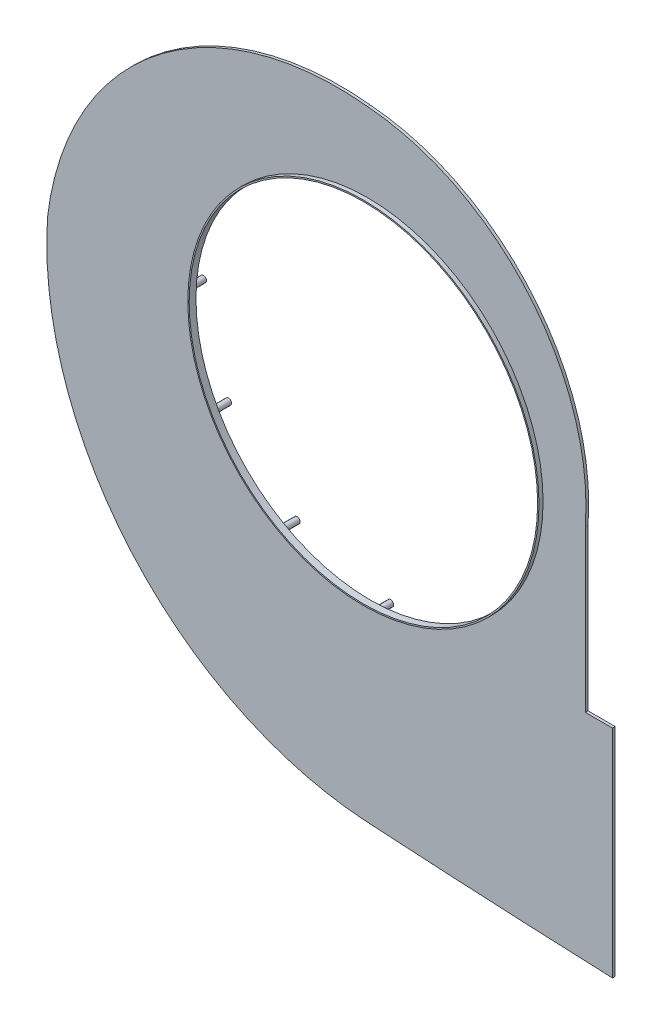
ISO-10303-21;
HEADER;
FILE_DESCRIPTION(('STEP AP214'),'2;1');
FILE_NAME('part.step','',(''),(''),'','','');
FILE_SCHEMA(('AUTOMOTIVE_DESIGN { 1 0 10303 214 1 1 1 1 }'));
ENDSEC;
DATA;
#1=APPLICATION_CONTEXT('core data for automotive mechanical design processes');
#2=APPLICATION_PROTOCOL_DEFINITION('international standard','automotive_design',2000,#1);
#3=PRODUCT_CONTEXT('',#1,'mechanical');
#4=PRODUCT('Part','Part','',(#3));
#5=PRODUCT_RELATED_PRODUCT_CATEGORY('part','',(#4));
#6=PRODUCT_DEFINITION_FORMATION('','',#4);
#7=PRODUCT_DEFINITION_CONTEXT('part definition',#1,'design');
#8=PRODUCT_DEFINITION('design','',#6,#7);
#9=PRODUCT_DEFINITION_SHAPE('','',#8);
#10=(LENGTH_UNIT() NAMED_UNIT(*) SI_UNIT(.MILLI.,.METRE.));
#11=(NAMED_UNIT(*) PLANE_ANGLE_UNIT() SI_UNIT($,.RADIAN.));
#12=(NAMED_UNIT(*) SI_UNIT($,.STERADIAN.) SOLID_ANGLE_UNIT());
#13=UNCERTAINTY_MEASURE_WITH_UNIT(LENGTH_MEASURE(1.E-05),#10,'distance_accuracy_value','');
#14=(GEOMETRIC_REPRESENTATION_CONTEXT(3) GLOBAL_UNCERTAINTY_ASSIGNED_CONTEXT((#13)) GLOBAL_UNIT_ASSIGNED_CONTEXT((#10,
#11,#12)) REPRESENTATION_CONTEXT('',''));
#15=CARTESIAN_POINT('',(0.,0.,0.));
#16=DIRECTION('',(0.,0.,1.));
#17=DIRECTION('',(1.,0.,0.));
#18=AXIS2_PLACEMENT_3D('',#15,#16,#17);
#19=CARTESIAN_POINT('',(576.066247787801,722.326123374747,4.));
#20=DIRECTION('',(0.,0.,-1.));
#21=DIRECTION('',(-1.,0.,0.));
#22=AXIS2_PLACEMENT_3D('',#19,#20,#21);
#23=CYLINDRICAL_SURFACE('',#22,501.999999999996);
#24=CARTESIAN_POINT('',(576.066247787801,722.326123374747,0.));
#25=DIRECTION('',(0.,0.,1.));
#26=DIRECTION('',(-1.,0.,0.));
#27=AXIS2_PLACEMENT_3D('',#24,#25,#26);
#28=CIRCLE('',#27,501.999999999996);
#29=CARTESIAN_POINT('',(75.2691276417093,757.057153497337,0.));
#30=VERTEX_POINT('',#29);
#31=CARTESIAN_POINT('',(545.269127641714,221.271697797341,0.));
#32=VERTEX_POINT('',#31);
#33=EDGE_CURVE('E140',#30,#32,#28,.T.);
#34=ORIENTED_EDGE('',*,*,#33,.T.);
#35=DIRECTION('',(0.,0.,-1.));
#36=VECTOR('',#35,1.);
#37=CARTESIAN_POINT('',(545.269127641714,221.271697797341,4.));
#38=LINE('',#37,#36);
#39=CARTESIAN_POINT('',(545.269127641714,221.271697797341,4.));
#40=VERTEX_POINT('',#39);
#41=EDGE_CURVE('E12',#40,#32,#38,.T.);
#42=ORIENTED_EDGE('',*,*,#41,.F.);
#43=CARTESIAN_POINT('',(576.066247787801,722.326123374747,4.));
#44=DIRECTION('',(0.,0.,1.));
#45=DIRECTION('',(-1.,0.,0.));
#46=AXIS2_PLACEMENT_3D('',#43,#44,#45);
#47=CIRCLE('',#46,501.999999999996);
#48=CARTESIAN_POINT('',(75.2691276417093,757.057153497337,4.));
#49=VERTEX_POINT('',#48);
#50=EDGE_CURVE('E152',#49,#40,#47,.T.);
#51=ORIENTED_EDGE('',*,*,#50,.F.);
#52=DIRECTION('',(0.,0.,-1.));
#53=VECTOR('',#52,1.);
#54=CARTESIAN_POINT('',(75.2691276417093,757.057153497337,4.));
#55=LINE('',#54,#53);
#56=EDGE_CURVE('E136',#49,#30,#55,.T.);
#57=ORIENTED_EDGE('',*,*,#56,.T.);
#58=EDGE_LOOP('',(#34,#42,#51,#57));
#59=FACE_BOUND('',#58,.T.);
#60=ADVANCED_FACE('F49',(#59),#23,.T.);
#61=CARTESIAN_POINT('',(1565.81350018343,16825.0408792696,4.));
#62=DIRECTION('',(0.,0.,-1.));
#63=DIRECTION('',(-1.,0.,0.));
#64=AXIS2_PLACEMENT_3D('',#61,#62,#63);
#65=CYLINDRICAL_SURFACE('',#64,16635.1033013906);
#66=CARTESIAN_POINT('',(1565.81350018343,16825.0408792696,0.));
#67=DIRECTION('',(0.,0.,1.));
#68=DIRECTION('',(1.,0.,0.));
#69=AXIS2_PLACEMENT_3D('',#66,#67,#68);
#70=CIRCLE('',#69,16635.1033013906);
#71=CARTESIAN_POINT('',(905.269127641709,203.057153497337,0.));
#72=VERTEX_POINT('',#71);
#73=EDGE_CURVE('E143',#32,#72,#70,.T.);
#74=ORIENTED_EDGE('',*,*,#73,.T.);
#75=DIRECTION('',(0.,0.,-1.));
#76=VECTOR('',#75,1.);
#77=CARTESIAN_POINT('',(905.269127641709,203.057153497337,4.));
#78=LINE('',#77,#76);
#79=CARTESIAN_POINT('',(905.269127641709,203.057153497337,4.));
#80=VERTEX_POINT('',#79);
#81=EDGE_CURVE('E58',#80,#72,#78,.T.);
#82=ORIENTED_EDGE('',*,*,#81,.F.);
#83=CARTESIAN_POINT('',(1565.81350018343,16825.0408792696,4.));
#84=DIRECTION('',(0.,0.,1.));
#85=DIRECTION('',(1.,0.,0.));
#86=AXIS2_PLACEMENT_3D('',#83,#84,#85);
#87=CIRCLE('',#86,16635.1033013906);
#88=EDGE_CURVE('E106',#40,#80,#87,.T.);
#89=ORIENTED_EDGE('',*,*,#88,.F.);
#90=ORIENTED_EDGE('',*,*,#41,.T.);
#91=EDGE_LOOP('',(#74,#82,#89,#90));
#92=FACE_BOUND('',#91,.T.);
#93=ADVANCED_FACE('F312',(#92),#65,.T.);
#94=CARTESIAN_POINT('',(905.269127641709,521.057153497337,4.));
#95=DIRECTION('',(-1.,0.,0.));
#96=DIRECTION('',(0.,0.,1.));
#97=AXIS2_PLACEMENT_3D('',#94,#95,#96);
#98=PLANE('',#97);
#99=DIRECTION('',(0.,1.,0.));
#100=VECTOR('',#99,1.);
#101=CARTESIAN_POINT('',(905.269127641709,521.057153497337,0.));
#102=LINE('',#101,#100);
#103=CARTESIAN_POINT('',(905.269127641709,521.057153497337,0.));
#104=VERTEX_POINT('',#103);
#105=EDGE_CURVE('E145',#72,#104,#102,.T.);
#106=ORIENTED_EDGE('',*,*,#105,.T.);
#107=DIRECTION('',(0.,0.,-1.));
#108=VECTOR('',#107,1.);
#109=CARTESIAN_POINT('',(905.269127641709,521.057153497337,4.));
#110=LINE('',#109,#108);
#111=CARTESIAN_POINT('',(905.269127641709,521.057153497337,4.));
#112=VERTEX_POINT('',#111);
#113=EDGE_CURVE('E156',#112,#104,#110,.T.);
#114=ORIENTED_EDGE('',*,*,#113,.F.);
#115=DIRECTION('',(0.,1.,0.));
#116=VECTOR('',#115,1.);
#117=CARTESIAN_POINT('',(905.269127641709,521.057153497337,4.));
#118=LINE('',#117,#116);
#119=EDGE_CURVE('E165',#80,#112,#118,.T.);
#120=ORIENTED_EDGE('',*,*,#119,.F.);
#121=ORIENTED_EDGE('',*,*,#81,.T.);
#122=EDGE_LOOP('',(#106,#114,#120,#121));
#123=FACE_BOUND('',#122,.T.);
#124=ADVANCED_FACE('F163',(#123),#98,.F.);
#125=CARTESIAN_POINT('',(865.269127641709,521.057153497337,4.));
#126=DIRECTION('',(0.,-1.,0.));
#127=DIRECTION('',(0.,0.,-1.));
#128=AXIS2_PLACEMENT_3D('',#125,#126,#127);
#129=PLANE('',#128);
#130=DIRECTION('',(-1.,0.,0.));
#131=VECTOR('',#130,1.);
#132=CARTESIAN_POINT('',(865.269127641709,521.057153497337,0.));
#133=LINE('',#132,#131);
#134=CARTESIAN_POINT('',(865.269127641709,521.057153497337,0.));
#135=VERTEX_POINT('',#134);
#136=EDGE_CURVE('E147',#104,#135,#133,.T.);
#137=ORIENTED_EDGE('',*,*,#136,.T.);
#138=DIRECTION('',(0.,0.,-1.));
#139=VECTOR('',#138,1.);
#140=CARTESIAN_POINT('',(865.269127641709,521.057153497337,4.));
#141=LINE('',#140,#139);
#142=CARTESIAN_POINT('',(865.269127641709,521.057153497337,4.));
#143=VERTEX_POINT('',#142);
#144=EDGE_CURVE('E131',#143,#135,#141,.T.);
#145=ORIENTED_EDGE('',*,*,#144,.F.);
#146=DIRECTION('',(-1.,0.,0.));
#147=VECTOR('',#146,1.);
#148=CARTESIAN_POINT('',(865.269127641709,521.057153497337,4.));
#149=LINE('',#148,#147);
#150=EDGE_CURVE('E122',#112,#143,#149,.T.);
#151=ORIENTED_EDGE('',*,*,#150,.F.);
#152=ORIENTED_EDGE('',*,*,#113,.T.);
#153=EDGE_LOOP('',(#137,#145,#151,#152));
#154=FACE_BOUND('',#153,.T.);
#155=ADVANCED_FACE('F172',(#154),#129,.F.);
#156=CARTESIAN_POINT('',(865.269127641709,521.057153497337,4.));
#157=DIRECTION('',(-1.,0.,0.));
#158=DIRECTION('',(0.,0.,1.));
#159=AXIS2_PLACEMENT_3D('',#156,#157,#158);
#160=PLANE('',#159);
#161=DIRECTION('',(0.,1.,0.));
#162=VECTOR('',#161,1.);
#163=CARTESIAN_POINT('',(865.269127641709,521.057153497337,0.));
#164=LINE('',#163,#162);
#165=CARTESIAN_POINT('',(865.269127641709,757.057153497337,0.));
#166=VERTEX_POINT('',#165);
#167=EDGE_CURVE('E130',#135,#166,#164,.T.);
#168=ORIENTED_EDGE('',*,*,#167,.T.);
#169=DIRECTION('',(0.,0.,-1.));
#170=VECTOR('',#169,1.);
#171=CARTESIAN_POINT('',(865.269127641709,757.057153497337,4.));
#172=LINE('',#171,#170);
#173=CARTESIAN_POINT('',(865.269127641709,757.057153497337,4.));
#174=VERTEX_POINT('',#173);
#175=EDGE_CURVE('E127',#174,#166,#172,.T.);
#176=ORIENTED_EDGE('',*,*,#175,.F.);
#177=DIRECTION('',(0.,1.,0.));
#178=VECTOR('',#177,1.);
#179=CARTESIAN_POINT('',(865.269127641709,521.057153497337,4.));
#180=LINE('',#179,#178);
#181=EDGE_CURVE('E116',#143,#174,#180,.T.);
#182=ORIENTED_EDGE('',*,*,#181,.F.);
#183=ORIENTED_EDGE('',*,*,#144,.T.);
#184=EDGE_LOOP('',(#168,#176,#182,#183));
#185=FACE_BOUND('',#184,.T.);
#186=ADVANCED_FACE('F128',(#185),#160,.F.);
#187=CARTESIAN_POINT('',(517.354671903609,784.203484600825,4.));
#188=DIRECTION('',(0.,0.,-1.));
#189=DIRECTION('',(-1.,0.,0.));
#190=AXIS2_PLACEMENT_3D('',#187,#188,#189);
#191=CYLINDRICAL_SURFACE('',#190,348.971906897846);
#192=CARTESIAN_POINT('',(517.354671903609,784.203484600825,0.));
#193=DIRECTION('',(0.,0.,1.));
#194=DIRECTION('',(-1.,0.,0.));
#195=AXIS2_PLACEMENT_3D('',#192,#193,#194);
#196=CIRCLE('',#195,348.971906897846);
#197=CARTESIAN_POINT('',(545.269127641709,1132.05715349734,0.));
#198=VERTEX_POINT('',#197);
#199=EDGE_CURVE('E92',#166,#198,#196,.T.);
#200=ORIENTED_EDGE('',*,*,#199,.T.);
#201=DIRECTION('',(0.,0.,-1.));
#202=VECTOR('',#201,1.);
#203=CARTESIAN_POINT('',(545.269127641709,1132.05715349734,4.));
#204=LINE('',#203,#202);
#205=CARTESIAN_POINT('',(545.269127641709,1132.05715349734,4.));
#206=VERTEX_POINT('',#205);
#207=EDGE_CURVE('E132',#206,#198,#204,.T.);
#208=ORIENTED_EDGE('',*,*,#207,.F.);
#209=CARTESIAN_POINT('',(517.354671903609,784.203484600825,4.));
#210=DIRECTION('',(0.,0.,1.));
#211=DIRECTION('',(-1.,0.,0.));
#212=AXIS2_PLACEMENT_3D('',#209,#210,#211);
#213=CIRCLE('',#212,348.971906897846);
#214=EDGE_CURVE('E120',#174,#206,#213,.T.);
#215=ORIENTED_EDGE('',*,*,#214,.F.);
#216=ORIENTED_EDGE('',*,*,#175,.T.);
#217=EDGE_LOOP('',(#200,#208,#215,#216));
#218=FACE_BOUND('',#217,.T.);
#219=ADVANCED_FACE('F134',(#218),#191,.T.);
#220=CARTESIAN_POINT('',(500.927222897748,705.599007443102,4.));
#221=DIRECTION('',(0.,0.,-1.));
#222=DIRECTION('',(-1.,0.,0.));
#223=AXIS2_PLACEMENT_3D('',#220,#221,#222);
#224=CYLINDRICAL_SURFACE('',#223,428.75722134133);
#225=CARTESIAN_POINT('',(500.927222897748,705.599007443102,0.));
#226=DIRECTION('',(0.,0.,1.));
#227=DIRECTION('',(-1.,0.,0.));
#228=AXIS2_PLACEMENT_3D('',#225,#226,#227);
#229=CIRCLE('',#228,428.75722134133);
#230=EDGE_CURVE('E98',#198,#30,#229,.T.);
#231=ORIENTED_EDGE('',*,*,#230,.T.);
#232=ORIENTED_EDGE('',*,*,#56,.F.);
#233=CARTESIAN_POINT('',(500.927222897748,705.599007443102,4.));
#234=DIRECTION('',(0.,0.,1.));
#235=DIRECTION('',(-1.,0.,0.));
#236=AXIS2_PLACEMENT_3D('',#233,#234,#235);
#237=CIRCLE('',#236,428.75722134133);
#238=EDGE_CURVE('E66',#206,#49,#237,.T.);
#239=ORIENTED_EDGE('',*,*,#238,.F.);
#240=ORIENTED_EDGE('',*,*,#207,.T.);
#241=EDGE_LOOP('',(#231,#232,#239,#240));
#242=FACE_BOUND('',#241,.T.);
#243=ADVANCED_FACE('F319',(#242),#224,.T.);
#244=CARTESIAN_POINT('',(576.066247787801,722.326123374747,4.));
#245=DIRECTION('',(0.,0.,-1.));
#246=DIRECTION('',(-1.,0.,0.));
#247=AXIS2_PLACEMENT_3D('',#244,#245,#246);
#248=PLANE('',#247);
#249=CARTESIAN_POINT('',(545.269127641709,758.057153497338,4.));
#250=DIRECTION('',(0.,0.,-1.));
#251=DIRECTION('',(-1.,0.,0.));
#252=AXIS2_PLACEMENT_3D('',#249,#250,#251);
#253=CIRCLE('',#252,258.);
#254=CARTESIAN_POINT('',(287.269127641709,758.057153497338,4.));
#255=VERTEX_POINT('',#254);
#256=EDGE_CURVE('E177',#255,#255,#253,.T.);
#257=ORIENTED_EDGE('',*,*,#256,.T.);
#258=EDGE_LOOP('',(#257));
#259=FACE_BOUND('',#258,.T.);
#260=ORIENTED_EDGE('',*,*,#50,.T.);
#261=ORIENTED_EDGE('',*,*,#88,.T.);
#262=ORIENTED_EDGE('',*,*,#119,.T.);
#263=ORIENTED_EDGE('',*,*,#150,.T.);
#264=ORIENTED_EDGE('',*,*,#181,.T.);
#265=ORIENTED_EDGE('',*,*,#214,.T.);
#266=ORIENTED_EDGE('',*,*,#238,.T.);
#267=EDGE_LOOP('',(#260,#261,#262,#263,#264,#265,#266));
#268=FACE_BOUND('',#267,.T.);
#269=ADVANCED_FACE('F118',(#259,#268),#248,.F.);
#270=CARTESIAN_POINT('',(576.066247787801,722.326123374747,0.));
#271=DIRECTION('',(0.,0.,-1.));
#272=DIRECTION('',(-1.,0.,0.));
#273=AXIS2_PLACEMENT_3D('',#270,#271,#272);
#274=PLANE('',#273);
#275=CARTESIAN_POINT('',(407.769127641712,996.21413953806,0.));
#276=DIRECTION('',(0.,0.,-1.));
#277=DIRECTION('',(-0.866025403784445,-0.499999999999989,0.));
#278=AXIS2_PLACEMENT_3D('',#275,#276,#277);
#279=CIRCLE('',#278,4.49999999999967);
#280=CARTESIAN_POINT('',(403.872013324682,993.96413953806,0.));
#281=VERTEX_POINT('',#280);
#282=EDGE_CURVE('E253',#281,#281,#279,.T.);
#283=ORIENTED_EDGE('',*,*,#282,.F.);
#284=EDGE_LOOP('',(#283));
#285=FACE_BOUND('',#284,.T.);
#286=CARTESIAN_POINT('',(307.11214160099,895.55715349734,0.));
#287=DIRECTION('',(0.,0.,-1.));
#288=DIRECTION('',(-0.50000000000001,-0.866025403784433,0.));
#289=AXIS2_PLACEMENT_3D('',#286,#287,#288);
#290=CIRCLE('',#289,4.49999999999967);
#291=CARTESIAN_POINT('',(304.86214160099,891.660039180311,0.));
#292=VERTEX_POINT('',#291);
#293=EDGE_CURVE('E247',#292,#292,#290,.T.);
#294=ORIENTED_EDGE('',*,*,#293,.F.);
#295=EDGE_LOOP('',(#294));
#296=FACE_BOUND('',#295,.T.);
#297=CARTESIAN_POINT('',(270.269127641709,758.05715349734,0.));
#298=DIRECTION('',(0.,0.,-1.));
#299=DIRECTION('',(0.,-1.,0.));
#300=AXIS2_PLACEMENT_3D('',#297,#298,#299);
#301=CIRCLE('',#300,4.49999999999967);
#302=CARTESIAN_POINT('',(270.269127641709,753.557153497341,0.));
#303=VERTEX_POINT('',#302);
#304=EDGE_CURVE('E241',#303,#303,#301,.T.);
#305=ORIENTED_EDGE('',*,*,#304,.F.);
#306=EDGE_LOOP('',(#305));
#307=FACE_BOUND('',#306,.T.);
#308=CARTESIAN_POINT('',(307.112141600987,620.55715349734,0.));
#309=DIRECTION('',(0.,0.,-1.));
#310=DIRECTION('',(0.499999999999992,-0.866025403784443,0.));
#311=AXIS2_PLACEMENT_3D('',#308,#309,#310);
#312=CIRCLE('',#311,4.49999999999967);
#313=CARTESIAN_POINT('',(309.362141600987,616.66003918031,0.));
#314=VERTEX_POINT('',#313);
#315=EDGE_CURVE('E235',#314,#314,#312,.T.);
#316=ORIENTED_EDGE('',*,*,#315,.F.);
#317=EDGE_LOOP('',(#316));
#318=FACE_BOUND('',#317,.T.);
#319=CARTESIAN_POINT('',(407.769127641707,519.900167456618,0.));
#320=DIRECTION('',(0.,0.,-1.));
#321=DIRECTION('',(0.866025403784435,-0.500000000000007,0.));
#322=AXIS2_PLACEMENT_3D('',#319,#320,#321);
#323=CIRCLE('',#322,4.49999999999967);
#324=CARTESIAN_POINT('',(411.666241958737,517.650167456618,0.));
#325=VERTEX_POINT('',#324);
#326=EDGE_CURVE('E229',#325,#325,#323,.T.);
#327=ORIENTED_EDGE('',*,*,#326,.F.);
#328=EDGE_LOOP('',(#327));
#329=FACE_BOUND('',#328,.T.);
#330=CARTESIAN_POINT('',(545.269127641709,483.057153497338,0.));
#331=DIRECTION('',(0.,0.,-1.));
#332=DIRECTION('',(1.,0.,0.));
#333=AXIS2_PLACEMENT_3D('',#330,#331,#332);
#334=CIRCLE('',#333,4.49999999999967);
#335=CARTESIAN_POINT('',(549.769127641709,483.057153497338,0.));
#336=VERTEX_POINT('',#335);
#337=EDGE_CURVE('E223',#336,#336,#334,.T.);
#338=ORIENTED_EDGE('',*,*,#337,.F.);
#339=EDGE_LOOP('',(#338));
#340=FACE_BOUND('',#339,.T.);
#341=CARTESIAN_POINT('',(682.769127641708,519.900167456616,0.));
#342=DIRECTION('',(0.,0.,-1.));
#343=DIRECTION('',(0.866025403784442,0.499999999999995,0.));
#344=AXIS2_PLACEMENT_3D('',#341,#342,#343);
#345=CIRCLE('',#344,4.49999999999967);
#346=CARTESIAN_POINT('',(686.666241958737,522.150167456616,0.));
#347=VERTEX_POINT('',#346);
#348=EDGE_CURVE('E217',#347,#347,#345,.T.);
#349=ORIENTED_EDGE('',*,*,#348,.F.);
#350=EDGE_LOOP('',(#349));
#351=FACE_BOUND('',#350,.T.);
#352=CARTESIAN_POINT('',(783.426113682429,620.557153497336,0.));
#353=DIRECTION('',(0.,0.,-1.));
#354=DIRECTION('',(0.500000000000004,0.866025403784436,0.));
#355=AXIS2_PLACEMENT_3D('',#352,#353,#354);
#356=CIRCLE('',#355,4.49999999999967);
#357=CARTESIAN_POINT('',(785.676113682429,624.454267814366,0.));
#358=VERTEX_POINT('',#357);
#359=EDGE_CURVE('E211',#358,#358,#356,.T.);
#360=ORIENTED_EDGE('',*,*,#359,.F.);
#361=EDGE_LOOP('',(#360));
#362=FACE_BOUND('',#361,.T.);
#363=CARTESIAN_POINT('',(820.269127641709,758.057153497337,0.));
#364=DIRECTION('',(0.,0.,-1.));
#365=DIRECTION('',(0.,1.,0.));
#366=AXIS2_PLACEMENT_3D('',#363,#364,#365);
#367=CIRCLE('',#366,4.49999999999967);
#368=CARTESIAN_POINT('',(820.269127641709,762.557153497336,0.));
#369=VERTEX_POINT('',#368);
#370=EDGE_CURVE('E205',#369,#369,#367,.T.);
#371=ORIENTED_EDGE('',*,*,#370,.F.);
#372=EDGE_LOOP('',(#371));
#373=FACE_BOUND('',#372,.T.);
#374=CARTESIAN_POINT('',(783.42611368243,895.557153497337,0.));
#375=DIRECTION('',(0.,0.,-1.));
#376=DIRECTION('',(-0.499999999999998,0.86602540378444,0.));
#377=AXIS2_PLACEMENT_3D('',#374,#375,#376);
#378=CIRCLE('',#377,4.49999999999967);
#379=CARTESIAN_POINT('',(781.17611368243,899.454267814367,0.));
#380=VERTEX_POINT('',#379);
#381=EDGE_CURVE('E199',#380,#380,#378,.T.);
#382=ORIENTED_EDGE('',*,*,#381,.F.);
#383=EDGE_LOOP('',(#382));
#384=FACE_BOUND('',#383,.T.);
#385=CARTESIAN_POINT('',(682.769127641709,996.214139538058,0.));
#386=DIRECTION('',(0.,0.,-1.));
#387=DIRECTION('',(-0.866025403784438,0.500000000000001,0.));
#388=AXIS2_PLACEMENT_3D('',#385,#386,#387);
#389=CIRCLE('',#388,4.49999999999967);
#390=CARTESIAN_POINT('',(678.87201332468,998.464139538058,0.));
#391=VERTEX_POINT('',#390);
#392=EDGE_CURVE('E193',#391,#391,#389,.T.);
#393=ORIENTED_EDGE('',*,*,#392,.F.);
#394=EDGE_LOOP('',(#393));
#395=FACE_BOUND('',#394,.T.);
#396=CARTESIAN_POINT('',(545.269127641709,1033.05715349734,0.));
#397=DIRECTION('',(0.,0.,-1.));
#398=DIRECTION('',(-1.,0.,0.));
#399=AXIS2_PLACEMENT_3D('',#396,#397,#398);
#400=CIRCLE('',#399,4.49999999999967);
#401=CARTESIAN_POINT('',(540.76912764171,1033.05715349734,0.));
#402=VERTEX_POINT('',#401);
#403=EDGE_CURVE('E187',#402,#402,#400,.T.);
#404=ORIENTED_EDGE('',*,*,#403,.F.);
#405=EDGE_LOOP('',(#404));
#406=FACE_BOUND('',#405,.T.);
#407=ORIENTED_EDGE('',*,*,#33,.F.);
#408=ORIENTED_EDGE('',*,*,#230,.F.);
#409=ORIENTED_EDGE('',*,*,#199,.F.);
#410=ORIENTED_EDGE('',*,*,#167,.F.);
#411=ORIENTED_EDGE('',*,*,#136,.F.);
#412=ORIENTED_EDGE('',*,*,#105,.F.);
#413=ORIENTED_EDGE('',*,*,#73,.F.);
#414=EDGE_LOOP('',(#407,#408,#409,#410,#411,#412,#413));
#415=FACE_BOUND('',#414,.T.);
#416=CARTESIAN_POINT('',(545.269127641709,758.057153497338,0.));
#417=DIRECTION('',(0.,0.,-1.));
#418=DIRECTION('',(-1.,0.,0.));
#419=AXIS2_PLACEMENT_3D('',#416,#417,#418);
#420=CIRCLE('',#419,256.);
#421=CARTESIAN_POINT('',(289.269127641709,758.057153497338,0.));
#422=VERTEX_POINT('',#421);
#423=EDGE_CURVE('E52',#422,#422,#420,.T.);
#424=ORIENTED_EDGE('',*,*,#423,.F.);
#425=EDGE_LOOP('',(#424));
#426=FACE_BOUND('',#425,.T.);
#427=ADVANCED_FACE('F169',(#285,#296,#307,#318,#329,#340,#351,#362,#373,#384,#395,#406,#415,
#426),#274,.T.);
#428=CARTESIAN_POINT('',(545.269127641709,758.057153497338,-46.));
#429=DIRECTION('',(0.,0.,1.));
#430=DIRECTION('',(1.,0.,0.));
#431=AXIS2_PLACEMENT_3D('',#428,#429,#430);
#432=CYLINDRICAL_SURFACE('',#431,256.);
#433=ORIENTED_EDGE('',*,*,#423,.T.);
#434=EDGE_LOOP('',(#433));
#435=FACE_BOUND('',#434,.T.);
#436=CARTESIAN_POINT('',(545.269127641709,758.057153497338,10.));
#437=DIRECTION('',(0.,0.,-1.));
#438=DIRECTION('',(-1.,0.,0.));
#439=AXIS2_PLACEMENT_3D('',#436,#437,#438);
#440=CIRCLE('',#439,256.);
#441=CARTESIAN_POINT('',(289.269127641709,758.057153497338,10.));
#442=VERTEX_POINT('',#441);
#443=EDGE_CURVE('E183',#442,#442,#440,.T.);
#444=ORIENTED_EDGE('',*,*,#443,.F.);
#445=EDGE_LOOP('',(#444));
#446=FACE_BOUND('',#445,.T.);
#447=ADVANCED_FACE('F270',(#435,#446),#432,.F.);
#448=CARTESIAN_POINT('',(545.269127641709,758.057153497338,10.));
#449=DIRECTION('',(0.,0.,-1.));
#450=DIRECTION('',(-1.,0.,0.));
#451=AXIS2_PLACEMENT_3D('',#448,#449,#450);
#452=CYLINDRICAL_SURFACE('',#451,258.);
#453=CARTESIAN_POINT('',(545.269127641709,758.057153497338,10.));
#454=DIRECTION('',(0.,0.,-1.));
#455=DIRECTION('',(-1.,0.,0.));
#456=AXIS2_PLACEMENT_3D('',#453,#454,#455);
#457=CIRCLE('',#456,258.);
#458=CARTESIAN_POINT('',(287.269127641709,758.057153497338,10.));
#459=VERTEX_POINT('',#458);
#460=EDGE_CURVE('E180',#459,#459,#457,.T.);
#461=ORIENTED_EDGE('',*,*,#460,.T.);
#462=EDGE_LOOP('',(#461));
#463=FACE_BOUND('',#462,.T.);
#464=ORIENTED_EDGE('',*,*,#256,.F.);
#465=EDGE_LOOP('',(#464));
#466=FACE_BOUND('',#465,.T.);
#467=ADVANCED_FACE('F307',(#463,#466),#452,.T.);
#468=CARTESIAN_POINT('',(545.269127641709,758.057153497338,10.));
#469=DIRECTION('',(0.,0.,-1.));
#470=DIRECTION('',(-1.,0.,0.));
#471=AXIS2_PLACEMENT_3D('',#468,#469,#470);
#472=PLANE('',#471);
#473=ORIENTED_EDGE('',*,*,#443,.T.);
#474=EDGE_LOOP('',(#473));
#475=FACE_BOUND('',#474,.T.);
#476=ORIENTED_EDGE('',*,*,#460,.F.);
#477=EDGE_LOOP('',(#476));
#478=FACE_BOUND('',#477,.T.);
#479=ADVANCED_FACE('F297',(#475,#478),#472,.F.);
#480=CARTESIAN_POINT('',(545.269127641709,1033.05715349734,-30.));
#481=DIRECTION('',(0.,0.,1.));
#482=DIRECTION('',(1.,0.,0.));
#483=AXIS2_PLACEMENT_3D('',#480,#481,#482);
#484=CYLINDRICAL_SURFACE('',#483,4.49999999999967);
#485=CARTESIAN_POINT('',(545.269127641709,1033.05715349734,-30.));
#486=DIRECTION('',(0.,0.,-1.));
#487=DIRECTION('',(-1.,0.,0.));
#488=AXIS2_PLACEMENT_3D('',#485,#486,#487);
#489=CIRCLE('',#488,4.49999999999967);
#490=CARTESIAN_POINT('',(540.76912764171,1033.05715349734,-30.));
#491=VERTEX_POINT('',#490);
#492=EDGE_CURVE('E186',#491,#491,#489,.T.);
#493=ORIENTED_EDGE('',*,*,#492,.F.);
#494=EDGE_LOOP('',(#493));
#495=FACE_BOUND('',#494,.T.);
#496=ORIENTED_EDGE('',*,*,#403,.T.);
#497=EDGE_LOOP('',(#496));
#498=FACE_BOUND('',#497,.T.);
#499=ADVANCED_FACE('F294',(#495,#498),#484,.T.);
#500=CARTESIAN_POINT('',(545.269127641709,1033.05715349734,-30.));
#501=DIRECTION('',(0.,0.,-1.));
#502=DIRECTION('',(-1.,0.,0.));
#503=AXIS2_PLACEMENT_3D('',#500,#501,#502);
#504=PLANE('',#503);
#505=ORIENTED_EDGE('',*,*,#492,.T.);
#506=EDGE_LOOP('',(#505));
#507=FACE_BOUND('',#506,.T.);
#508=ADVANCED_FACE('F296',(#507),#504,.T.);
#509=CARTESIAN_POINT('',(682.769127641709,996.214139538058,-30.));
#510=DIRECTION('',(0.,0.,1.));
#511=DIRECTION('',(1.,0.,0.));
#512=AXIS2_PLACEMENT_3D('',#509,#510,#511);
#513=CYLINDRICAL_SURFACE('',#512,4.49999999999967);
#514=CARTESIAN_POINT('',(682.769127641709,996.214139538058,-30.));
#515=DIRECTION('',(0.,0.,-1.));
#516=DIRECTION('',(-0.866025403784438,0.500000000000001,0.));
#517=AXIS2_PLACEMENT_3D('',#514,#515,#516);
#518=CIRCLE('',#517,4.49999999999967);
#519=CARTESIAN_POINT('',(678.87201332468,998.464139538058,-30.));
#520=VERTEX_POINT('',#519);
#521=EDGE_CURVE('E190',#520,#520,#518,.T.);
#522=ORIENTED_EDGE('',*,*,#521,.F.);
#523=EDGE_LOOP('',(#522));
#524=FACE_BOUND('',#523,.T.);
#525=ORIENTED_EDGE('',*,*,#392,.T.);
#526=EDGE_LOOP('',(#525));
#527=FACE_BOUND('',#526,.T.);
#528=ADVANCED_FACE('F304',(#524,#527),#513,.T.);
#529=CARTESIAN_POINT('',(682.769127641709,996.214139538058,-30.));
#530=DIRECTION('',(0.,0.,-1.));
#531=DIRECTION('',(-0.866025403784438,0.500000000000001,0.));
#532=AXIS2_PLACEMENT_3D('',#529,#530,#531);
#533=PLANE('',#532);
#534=ORIENTED_EDGE('',*,*,#521,.T.);
#535=EDGE_LOOP('',(#534));
#536=FACE_BOUND('',#535,.T.);
#537=ADVANCED_FACE('F411',(#536),#533,.T.);
#538=CARTESIAN_POINT('',(783.42611368243,895.557153497337,-30.));
#539=DIRECTION('',(0.,0.,1.));
#540=DIRECTION('',(1.,0.,0.));
#541=AXIS2_PLACEMENT_3D('',#538,#539,#540);
#542=CYLINDRICAL_SURFACE('',#541,4.49999999999967);
#543=CARTESIAN_POINT('',(783.42611368243,895.557153497337,-30.));
#544=DIRECTION('',(0.,0.,-1.));
#545=DIRECTION('',(-0.499999999999998,0.86602540378444,0.));
#546=AXIS2_PLACEMENT_3D('',#543,#544,#545);
#547=CIRCLE('',#546,4.49999999999967);
#548=CARTESIAN_POINT('',(781.17611368243,899.454267814367,-30.));
#549=VERTEX_POINT('',#548);
#550=EDGE_CURVE('E196',#549,#549,#547,.T.);
#551=ORIENTED_EDGE('',*,*,#550,.F.);
#552=EDGE_LOOP('',(#551));
#553=FACE_BOUND('',#552,.T.);
#554=ORIENTED_EDGE('',*,*,#381,.T.);
#555=EDGE_LOOP('',(#554));
#556=FACE_BOUND('',#555,.T.);
#557=ADVANCED_FACE('F421',(#553,#556),#542,.T.);
#558=CARTESIAN_POINT('',(783.42611368243,895.557153497337,-30.));
#559=DIRECTION('',(0.,0.,-1.));
#560=DIRECTION('',(-0.499999999999998,0.86602540378444,0.));
#561=AXIS2_PLACEMENT_3D('',#558,#559,#560);
#562=PLANE('',#561);
#563=ORIENTED_EDGE('',*,*,#550,.T.);
#564=EDGE_LOOP('',(#563));
#565=FACE_BOUND('',#564,.T.);
#566=ADVANCED_FACE('F431',(#565),#562,.T.);
#567=CARTESIAN_POINT('',(820.269127641709,758.057153497337,-30.));
#568=DIRECTION('',(0.,0.,1.));
#569=DIRECTION('',(1.,0.,0.));
#570=AXIS2_PLACEMENT_3D('',#567,#568,#569);
#571=CYLINDRICAL_SURFACE('',#570,4.49999999999967);
#572=CARTESIAN_POINT('',(820.269127641709,758.057153497337,-30.));
#573=DIRECTION('',(0.,0.,-1.));
#574=DIRECTION('',(0.,1.,0.));
#575=AXIS2_PLACEMENT_3D('',#572,#573,#574);
#576=CIRCLE('',#575,4.49999999999967);
#577=CARTESIAN_POINT('',(820.269127641709,762.557153497336,-30.));
#578=VERTEX_POINT('',#577);
#579=EDGE_CURVE('E202',#578,#578,#576,.T.);
#580=ORIENTED_EDGE('',*,*,#579,.F.);
#581=EDGE_LOOP('',(#580));
#582=FACE_BOUND('',#581,.T.);
#583=ORIENTED_EDGE('',*,*,#370,.T.);
#584=EDGE_LOOP('',(#583));
#585=FACE_BOUND('',#584,.T.);
#586=ADVANCED_FACE('F441',(#582,#585),#571,.T.);
#587=CARTESIAN_POINT('',(820.269127641709,758.057153497337,-30.));
#588=DIRECTION('',(0.,0.,-1.));
#589=DIRECTION('',(0.,1.,0.));
#590=AXIS2_PLACEMENT_3D('',#587,#588,#589);
#591=PLANE('',#590);
#592=ORIENTED_EDGE('',*,*,#579,.T.);
#593=EDGE_LOOP('',(#592));
#594=FACE_BOUND('',#593,.T.);
#595=ADVANCED_FACE('F451',(#594),#591,.T.);
#596=CARTESIAN_POINT('',(783.426113682429,620.557153497336,-30.));
#597=DIRECTION('',(0.,0.,1.));
#598=DIRECTION('',(1.,0.,0.));
#599=AXIS2_PLACEMENT_3D('',#596,#597,#598);
#600=CYLINDRICAL_SURFACE('',#599,4.49999999999967);
#601=CARTESIAN_POINT('',(783.426113682429,620.557153497336,-30.));
#602=DIRECTION('',(0.,0.,-1.));
#603=DIRECTION('',(0.500000000000004,0.866025403784436,0.));
#604=AXIS2_PLACEMENT_3D('',#601,#602,#603);
#605=CIRCLE('',#604,4.49999999999967);
#606=CARTESIAN_POINT('',(785.676113682429,624.454267814366,-30.));
#607=VERTEX_POINT('',#606);
#608=EDGE_CURVE('E208',#607,#607,#605,.T.);
#609=ORIENTED_EDGE('',*,*,#608,.F.);
#610=EDGE_LOOP('',(#609));
#611=FACE_BOUND('',#610,.T.);
#612=ORIENTED_EDGE('',*,*,#359,.T.);
#613=EDGE_LOOP('',(#612));
#614=FACE_BOUND('',#613,.T.);
#615=ADVANCED_FACE('F461',(#611,#614),#600,.T.);
#616=CARTESIAN_POINT('',(783.426113682429,620.557153497336,-30.));
#617=DIRECTION('',(0.,0.,-1.));
#618=DIRECTION('',(0.500000000000004,0.866025403784436,0.));
#619=AXIS2_PLACEMENT_3D('',#616,#617,#618);
#620=PLANE('',#619);
#621=ORIENTED_EDGE('',*,*,#608,.T.);
#622=EDGE_LOOP('',(#621));
#623=FACE_BOUND('',#622,.T.);
#624=ADVANCED_FACE('F471',(#623),#620,.T.);
#625=CARTESIAN_POINT('',(682.769127641708,519.900167456616,-30.));
#626=DIRECTION('',(0.,0.,1.));
#627=DIRECTION('',(1.,0.,0.));
#628=AXIS2_PLACEMENT_3D('',#625,#626,#627);
#629=CYLINDRICAL_SURFACE('',#628,4.49999999999967);
#630=CARTESIAN_POINT('',(682.769127641708,519.900167456616,-30.));
#631=DIRECTION('',(0.,0.,-1.));
#632=DIRECTION('',(0.866025403784442,0.499999999999995,0.));
#633=AXIS2_PLACEMENT_3D('',#630,#631,#632);
#634=CIRCLE('',#633,4.49999999999967);
#635=CARTESIAN_POINT('',(686.666241958737,522.150167456616,-30.));
#636=VERTEX_POINT('',#635);
#637=EDGE_CURVE('E214',#636,#636,#634,.T.);
#638=ORIENTED_EDGE('',*,*,#637,.F.);
#639=EDGE_LOOP('',(#638));
#640=FACE_BOUND('',#639,.T.);
#641=ORIENTED_EDGE('',*,*,#348,.T.);
#642=EDGE_LOOP('',(#641));
#643=FACE_BOUND('',#642,.T.);
#644=ADVANCED_FACE('F481',(#640,#643),#629,.T.);
#645=CARTESIAN_POINT('',(682.769127641708,519.900167456616,-30.));
#646=DIRECTION('',(0.,0.,-1.));
#647=DIRECTION('',(0.866025403784442,0.499999999999995,0.));
#648=AXIS2_PLACEMENT_3D('',#645,#646,#647);
#649=PLANE('',#648);
#650=ORIENTED_EDGE('',*,*,#637,.T.);
#651=EDGE_LOOP('',(#650));
#652=FACE_BOUND('',#651,.T.);
#653=ADVANCED_FACE('F491',(#652),#649,.T.);
#654=CARTESIAN_POINT('',(545.269127641709,483.057153497338,-30.));
#655=DIRECTION('',(0.,0.,1.));
#656=DIRECTION('',(1.,0.,0.));
#657=AXIS2_PLACEMENT_3D('',#654,#655,#656);
#658=CYLINDRICAL_SURFACE('',#657,4.49999999999967);
#659=CARTESIAN_POINT('',(545.269127641709,483.057153497338,-30.));
#660=DIRECTION('',(0.,0.,-1.));
#661=DIRECTION('',(1.,0.,0.));
#662=AXIS2_PLACEMENT_3D('',#659,#660,#661);
#663=CIRCLE('',#662,4.49999999999967);
#664=CARTESIAN_POINT('',(549.769127641709,483.057153497338,-30.));
#665=VERTEX_POINT('',#664);
#666=EDGE_CURVE('E220',#665,#665,#663,.T.);
#667=ORIENTED_EDGE('',*,*,#666,.F.);
#668=EDGE_LOOP('',(#667));
#669=FACE_BOUND('',#668,.T.);
#670=ORIENTED_EDGE('',*,*,#337,.T.);
#671=EDGE_LOOP('',(#670));
#672=FACE_BOUND('',#671,.T.);
#673=ADVANCED_FACE('F501',(#669,#672),#658,.T.);
#674=CARTESIAN_POINT('',(545.269127641709,483.057153497338,-30.));
#675=DIRECTION('',(0.,0.,-1.));
#676=DIRECTION('',(1.,0.,0.));
#677=AXIS2_PLACEMENT_3D('',#674,#675,#676);
#678=PLANE('',#677);
#679=ORIENTED_EDGE('',*,*,#666,.T.);
#680=EDGE_LOOP('',(#679));
#681=FACE_BOUND('',#680,.T.);
#682=ADVANCED_FACE('F511',(#681),#678,.T.);
#683=CARTESIAN_POINT('',(407.769127641707,519.900167456618,-30.));
#684=DIRECTION('',(0.,0.,1.));
#685=DIRECTION('',(1.,0.,0.));
#686=AXIS2_PLACEMENT_3D('',#683,#684,#685);
#687=CYLINDRICAL_SURFACE('',#686,4.49999999999967);
#688=CARTESIAN_POINT('',(407.769127641707,519.900167456618,-30.));
#689=DIRECTION('',(0.,0.,-1.));
#690=DIRECTION('',(0.866025403784435,-0.500000000000007,0.));
#691=AXIS2_PLACEMENT_3D('',#688,#689,#690);
#692=CIRCLE('',#691,4.49999999999967);
#693=CARTESIAN_POINT('',(411.666241958737,517.650167456618,-30.));
#694=VERTEX_POINT('',#693);
#695=EDGE_CURVE('E226',#694,#694,#692,.T.);
#696=ORIENTED_EDGE('',*,*,#695,.F.);
#697=EDGE_LOOP('',(#696));
#698=FACE_BOUND('',#697,.T.);
#699=ORIENTED_EDGE('',*,*,#326,.T.);
#700=EDGE_LOOP('',(#699));
#701=FACE_BOUND('',#700,.T.);
#702=ADVANCED_FACE('F521',(#698,#701),#687,.T.);
#703=CARTESIAN_POINT('',(407.769127641707,519.900167456618,-30.));
#704=DIRECTION('',(0.,0.,-1.));
#705=DIRECTION('',(0.866025403784435,-0.500000000000007,0.));
#706=AXIS2_PLACEMENT_3D('',#703,#704,#705);
#707=PLANE('',#706);
#708=ORIENTED_EDGE('',*,*,#695,.T.);
#709=EDGE_LOOP('',(#708));
#710=FACE_BOUND('',#709,.T.);
#711=ADVANCED_FACE('F531',(#710),#707,.T.);
#712=CARTESIAN_POINT('',(307.112141600987,620.55715349734,-30.));
#713=DIRECTION('',(0.,0.,1.));
#714=DIRECTION('',(1.,0.,0.));
#715=AXIS2_PLACEMENT_3D('',#712,#713,#714);
#716=CYLINDRICAL_SURFACE('',#715,4.49999999999967);
#717=CARTESIAN_POINT('',(307.112141600987,620.55715349734,-30.));
#718=DIRECTION('',(0.,0.,-1.));
#719=DIRECTION('',(0.499999999999992,-0.866025403784443,0.));
#720=AXIS2_PLACEMENT_3D('',#717,#718,#719);
#721=CIRCLE('',#720,4.49999999999967);
#722=CARTESIAN_POINT('',(309.362141600987,616.66003918031,-30.));
#723=VERTEX_POINT('',#722);
#724=EDGE_CURVE('E232',#723,#723,#721,.T.);
#725=ORIENTED_EDGE('',*,*,#724,.F.);
#726=EDGE_LOOP('',(#725));
#727=FACE_BOUND('',#726,.T.);
#728=ORIENTED_EDGE('',*,*,#315,.T.);
#729=EDGE_LOOP('',(#728));
#730=FACE_BOUND('',#729,.T.);
#731=ADVANCED_FACE('F541',(#727,#730),#716,.T.);
#732=CARTESIAN_POINT('',(307.112141600987,620.55715349734,-30.));
#733=DIRECTION('',(0.,0.,-1.));
#734=DIRECTION('',(0.499999999999992,-0.866025403784443,0.));
#735=AXIS2_PLACEMENT_3D('',#732,#733,#734);
#736=PLANE('',#735);
#737=ORIENTED_EDGE('',*,*,#724,.T.);
#738=EDGE_LOOP('',(#737));
#739=FACE_BOUND('',#738,.T.);
#740=ADVANCED_FACE('F551',(#739),#736,.T.);
#741=CARTESIAN_POINT('',(270.269127641709,758.05715349734,-30.));
#742=DIRECTION('',(0.,0.,1.));
#743=DIRECTION('',(1.,0.,0.));
#744=AXIS2_PLACEMENT_3D('',#741,#742,#743);
#745=CYLINDRICAL_SURFACE('',#744,4.49999999999967);
#746=CARTESIAN_POINT('',(270.269127641709,758.05715349734,-30.));
#747=DIRECTION('',(0.,0.,-1.));
#748=DIRECTION('',(0.,-1.,0.));
#749=AXIS2_PLACEMENT_3D('',#746,#747,#748);
#750=CIRCLE('',#749,4.49999999999967);
#751=CARTESIAN_POINT('',(270.269127641709,753.557153497341,-30.));
#752=VERTEX_POINT('',#751);
#753=EDGE_CURVE('E238',#752,#752,#750,.T.);
#754=ORIENTED_EDGE('',*,*,#753,.F.);
#755=EDGE_LOOP('',(#754));
#756=FACE_BOUND('',#755,.T.);
#757=ORIENTED_EDGE('',*,*,#304,.T.);
#758=EDGE_LOOP('',(#757));
#759=FACE_BOUND('',#758,.T.);
#760=ADVANCED_FACE('F561',(#756,#759),#745,.T.);
#761=CARTESIAN_POINT('',(270.269127641709,758.05715349734,-30.));
#762=DIRECTION('',(0.,0.,-1.));
#763=DIRECTION('',(0.,-1.,0.));
#764=AXIS2_PLACEMENT_3D('',#761,#762,#763);
#765=PLANE('',#764);
#766=ORIENTED_EDGE('',*,*,#753,.T.);
#767=EDGE_LOOP('',(#766));
#768=FACE_BOUND('',#767,.T.);
#769=ADVANCED_FACE('F571',(#768),#765,.T.);
#770=CARTESIAN_POINT('',(307.11214160099,895.55715349734,-30.));
#771=DIRECTION('',(0.,0.,1.));
#772=DIRECTION('',(1.,0.,0.));
#773=AXIS2_PLACEMENT_3D('',#770,#771,#772);
#774=CYLINDRICAL_SURFACE('',#773,4.49999999999967);
#775=CARTESIAN_POINT('',(307.11214160099,895.55715349734,-30.));
#776=DIRECTION('',(0.,0.,-1.));
#777=DIRECTION('',(-0.50000000000001,-0.866025403784433,0.));
#778=AXIS2_PLACEMENT_3D('',#775,#776,#777);
#779=CIRCLE('',#778,4.49999999999967);
#780=CARTESIAN_POINT('',(304.86214160099,891.660039180311,-30.));
#781=VERTEX_POINT('',#780);
#782=EDGE_CURVE('E244',#781,#781,#779,.T.);
#783=ORIENTED_EDGE('',*,*,#782,.F.);
#784=EDGE_LOOP('',(#783));
#785=FACE_BOUND('',#784,.T.);
#786=ORIENTED_EDGE('',*,*,#293,.T.);
#787=EDGE_LOOP('',(#786));
#788=FACE_BOUND('',#787,.T.);
#789=ADVANCED_FACE('F581',(#785,#788),#774,.T.);
#790=CARTESIAN_POINT('',(307.11214160099,895.55715349734,-30.));
#791=DIRECTION('',(0.,0.,-1.));
#792=DIRECTION('',(-0.50000000000001,-0.866025403784433,0.));
#793=AXIS2_PLACEMENT_3D('',#790,#791,#792);
#794=PLANE('',#793);
#795=ORIENTED_EDGE('',*,*,#782,.T.);
#796=EDGE_LOOP('',(#795));
#797=FACE_BOUND('',#796,.T.);
#798=ADVANCED_FACE('F264',(#797),#794,.T.);
#799=CARTESIAN_POINT('',(407.769127641712,996.21413953806,-30.));
#800=DIRECTION('',(0.,0.,1.));
#801=DIRECTION('',(1.,0.,0.));
#802=AXIS2_PLACEMENT_3D('',#799,#800,#801);
#803=CYLINDRICAL_SURFACE('',#802,4.49999999999967);
#804=CARTESIAN_POINT('',(407.769127641712,996.21413953806,-30.));
#805=DIRECTION('',(0.,0.,-1.));
#806=DIRECTION('',(-0.866025403784445,-0.499999999999989,0.));
#807=AXIS2_PLACEMENT_3D('',#804,#805,#806);
#808=CIRCLE('',#807,4.49999999999967);
#809=CARTESIAN_POINT('',(403.872013324682,993.96413953806,-30.));
#810=VERTEX_POINT('',#809);
#811=EDGE_CURVE('E250',#810,#810,#808,.T.);
#812=ORIENTED_EDGE('',*,*,#811,.F.);
#813=EDGE_LOOP('',(#812));
#814=FACE_BOUND('',#813,.T.);
#815=ORIENTED_EDGE('',*,*,#282,.T.);
#816=EDGE_LOOP('',(#815));
#817=FACE_BOUND('',#816,.T.);
#818=ADVANCED_FACE('F261',(#814,#817),#803,.T.);
#819=CARTESIAN_POINT('',(407.769127641712,996.21413953806,-30.));
#820=DIRECTION('',(0.,0.,-1.));
#821=DIRECTION('',(-0.866025403784445,-0.499999999999989,0.));
#822=AXIS2_PLACEMENT_3D('',#819,#820,#821);
#823=PLANE('',#822);
#824=ORIENTED_EDGE('',*,*,#811,.T.);
#825=EDGE_LOOP('',(#824));
#826=FACE_BOUND('',#825,.T.);
#827=ADVANCED_FACE('F259',(#826),#823,.T.);
#828=CLOSED_SHELL('',(#60,#93,#124,#155,#186,#219,#243,#269,#427,#447,#467,#479,#499,#508,#528,
#537,#557,#566,#586,#595,#615,#624,#644,#653,#673,#682,#702,#711,#731,#740,#760,#769,#789,#798,
#818,#827));
#829=MANIFOLD_SOLID_BREP('B2',#828);
#830=ADVANCED_BREP_SHAPE_REPRESENTATION('',(#18,#829),#14);
#831=SHAPE_DEFINITION_REPRESENTATION(#9,#830);
ENDSEC;
END-ISO-10303-21;
